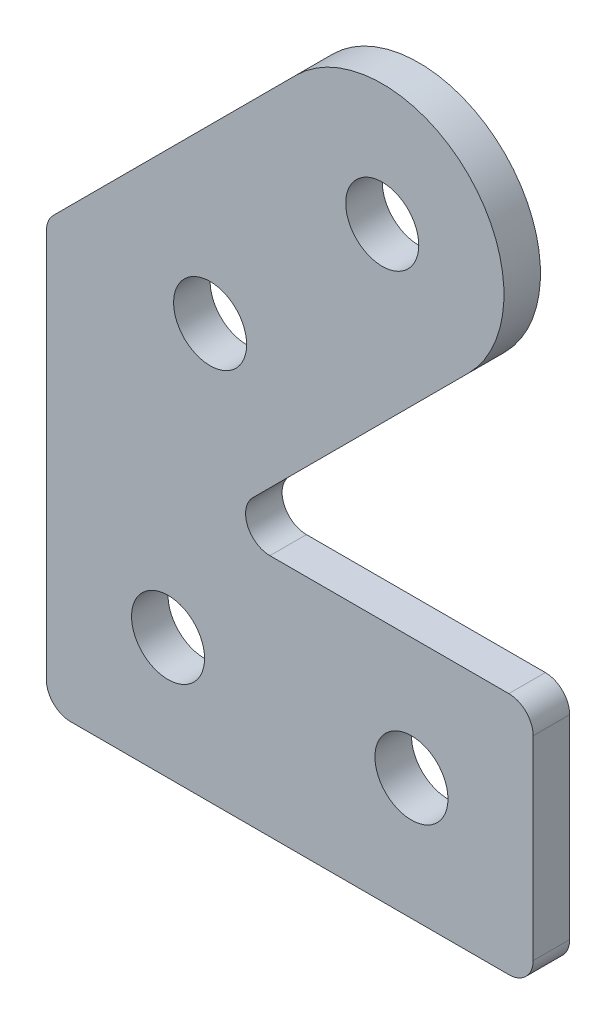
ISO-10303-21;
HEADER;
FILE_DESCRIPTION(('STEP AP214'),'2;1');
FILE_NAME('part.step','',(''),(''),'','','');
FILE_SCHEMA(('AUTOMOTIVE_DESIGN { 1 0 10303 214 1 1 1 1 }'));
ENDSEC;
DATA;
#1=APPLICATION_CONTEXT('core data for automotive mechanical design processes');
#2=APPLICATION_PROTOCOL_DEFINITION('international standard','automotive_design',2000,#1);
#3=PRODUCT_CONTEXT('',#1,'mechanical');
#4=PRODUCT('Part','Part','',(#3));
#5=PRODUCT_RELATED_PRODUCT_CATEGORY('part','',(#4));
#6=PRODUCT_DEFINITION_FORMATION('','',#4);
#7=PRODUCT_DEFINITION_CONTEXT('part definition',#1,'design');
#8=PRODUCT_DEFINITION('design','',#6,#7);
#9=PRODUCT_DEFINITION_SHAPE('','',#8);
#10=(LENGTH_UNIT() NAMED_UNIT(*) SI_UNIT(.MILLI.,.METRE.));
#11=(NAMED_UNIT(*) PLANE_ANGLE_UNIT() SI_UNIT($,.RADIAN.));
#12=(NAMED_UNIT(*) SI_UNIT($,.STERADIAN.) SOLID_ANGLE_UNIT());
#13=UNCERTAINTY_MEASURE_WITH_UNIT(LENGTH_MEASURE(1.E-05),#10,'distance_accuracy_value','');
#14=(GEOMETRIC_REPRESENTATION_CONTEXT(3) GLOBAL_UNCERTAINTY_ASSIGNED_CONTEXT((#13)) GLOBAL_UNIT_ASSIGNED_CONTEXT((#10,
#11,#12)) REPRESENTATION_CONTEXT('',''));
#15=CARTESIAN_POINT('',(0.,0.,0.));
#16=DIRECTION('',(0.,0.,1.));
#17=DIRECTION('',(1.,0.,0.));
#18=AXIS2_PLACEMENT_3D('',#15,#16,#17);
#19=CARTESIAN_POINT('',(20.,10.,1.5));
#20=DIRECTION('',(0.,-1.,0.));
#21=DIRECTION('',(1.,0.,0.));
#22=AXIS2_PLACEMENT_3D('',#19,#20,#21);
#23=PLANE('',#22);
#24=DIRECTION('',(-1.,0.,0.));
#25=VECTOR('',#24,1.);
#26=CARTESIAN_POINT('',(20.,10.,1.5));
#27=LINE('',#26,#25);
#28=CARTESIAN_POINT('',(19.,10.,1.5));
#29=VERTEX_POINT('',#28);
#30=CARTESIAN_POINT('',(9.1852813742386,10.,1.5));
#31=VERTEX_POINT('',#30);
#32=EDGE_CURVE('E171',#29,#31,#27,.T.);
#33=ORIENTED_EDGE('',*,*,#32,.F.);
#34=DIRECTION('',(0.,0.,-1.));
#35=VECTOR('',#34,1.);
#36=CARTESIAN_POINT('',(19.,10.,1.5));
#37=LINE('',#36,#35);
#38=CARTESIAN_POINT('',(19.,10.,0.));
#39=VERTEX_POINT('',#38);
#40=EDGE_CURVE('E236',#29,#39,#37,.T.);
#41=ORIENTED_EDGE('',*,*,#40,.T.);
#42=DIRECTION('',(-1.,0.,0.));
#43=VECTOR('',#42,1.);
#44=CARTESIAN_POINT('',(20.,10.,0.));
#45=LINE('',#44,#43);
#46=CARTESIAN_POINT('',(9.1852813742386,10.,0.));
#47=VERTEX_POINT('',#46);
#48=EDGE_CURVE('E201',#39,#47,#45,.T.);
#49=ORIENTED_EDGE('',*,*,#48,.T.);
#50=DIRECTION('',(0.,0.,-1.));
#51=VECTOR('',#50,1.);
#52=CARTESIAN_POINT('',(9.1852813742386,10.,1.5));
#53=LINE('',#52,#51);
#54=EDGE_CURVE('E234',#47,#31,#53,.F.);
#55=ORIENTED_EDGE('',*,*,#54,.T.);
#56=EDGE_LOOP('',(#33,#41,#49,#55));
#57=FACE_BOUND('',#56,.T.);
#58=ADVANCED_FACE('F32',(#57),#23,.F.);
#59=CARTESIAN_POINT('',(20.,10.,1.5));
#60=DIRECTION('',(-1.,0.,0.));
#61=DIRECTION('',(0.,0.,1.));
#62=AXIS2_PLACEMENT_3D('',#59,#60,#61);
#63=PLANE('',#62);
#64=DIRECTION('',(0.,1.,0.));
#65=VECTOR('',#64,1.);
#66=CARTESIAN_POINT('',(20.,10.,1.5));
#67=LINE('',#66,#65);
#68=CARTESIAN_POINT('',(20.,0.999999999999999,1.5));
#69=VERTEX_POINT('',#68);
#70=CARTESIAN_POINT('',(20.,9.,1.5));
#71=VERTEX_POINT('',#70);
#72=EDGE_CURVE('E168',#69,#71,#67,.T.);
#73=ORIENTED_EDGE('',*,*,#72,.F.);
#74=DIRECTION('',(0.,0.,-1.));
#75=VECTOR('',#74,1.);
#76=CARTESIAN_POINT('',(20.,0.999999999999999,1.5));
#77=LINE('',#76,#75);
#78=CARTESIAN_POINT('',(20.,0.999999999999999,0.));
#79=VERTEX_POINT('',#78);
#80=EDGE_CURVE('E232',#69,#79,#77,.T.);
#81=ORIENTED_EDGE('',*,*,#80,.T.);
#82=DIRECTION('',(0.,1.,0.));
#83=VECTOR('',#82,1.);
#84=CARTESIAN_POINT('',(20.,10.,0.));
#85=LINE('',#84,#83);
#86=CARTESIAN_POINT('',(20.,9.,0.));
#87=VERTEX_POINT('',#86);
#88=EDGE_CURVE('E167',#79,#87,#85,.T.);
#89=ORIENTED_EDGE('',*,*,#88,.T.);
#90=DIRECTION('',(0.,0.,-1.));
#91=VECTOR('',#90,1.);
#92=CARTESIAN_POINT('',(20.,9.,1.5));
#93=LINE('',#92,#91);
#94=EDGE_CURVE('E226',#87,#71,#93,.F.);
#95=ORIENTED_EDGE('',*,*,#94,.T.);
#96=EDGE_LOOP('',(#73,#81,#89,#95));
#97=FACE_BOUND('',#96,.T.);
#98=ADVANCED_FACE('F255',(#97),#63,.F.);
#99=CARTESIAN_POINT('',(0.,0.,1.5));
#100=DIRECTION('',(1.,0.,0.));
#101=DIRECTION('',(0.,0.,-1.));
#102=AXIS2_PLACEMENT_3D('',#99,#100,#101);
#103=PLANE('',#102);
#104=DIRECTION('',(0.,-1.,0.));
#105=VECTOR('',#104,1.);
#106=CARTESIAN_POINT('',(0.,0.,1.5));
#107=LINE('',#106,#105);
#108=CARTESIAN_POINT('',(0.,16.9568542494923,1.5));
#109=VERTEX_POINT('',#108);
#110=CARTESIAN_POINT('',(0.,1.,1.5));
#111=VERTEX_POINT('',#110);
#112=EDGE_CURVE('E175',#109,#111,#107,.T.);
#113=ORIENTED_EDGE('',*,*,#112,.F.);
#114=DIRECTION('',(0.,0.,-1.));
#115=VECTOR('',#114,1.);
#116=CARTESIAN_POINT('',(0.,16.9568542494923,1.5));
#117=LINE('',#116,#115);
#118=CARTESIAN_POINT('',(0.,16.9568542494923,0.));
#119=VERTEX_POINT('',#118);
#120=EDGE_CURVE('E195',#109,#119,#117,.T.);
#121=ORIENTED_EDGE('',*,*,#120,.T.);
#122=DIRECTION('',(0.,-1.,0.));
#123=VECTOR('',#122,1.);
#124=CARTESIAN_POINT('',(0.,0.,0.));
#125=LINE('',#124,#123);
#126=CARTESIAN_POINT('',(0.,1.,0.));
#127=VERTEX_POINT('',#126);
#128=EDGE_CURVE('E205',#119,#127,#125,.T.);
#129=ORIENTED_EDGE('',*,*,#128,.T.);
#130=DIRECTION('',(0.,0.,-1.));
#131=VECTOR('',#130,1.);
#132=CARTESIAN_POINT('',(0.,1.,1.5));
#133=LINE('',#132,#131);
#134=EDGE_CURVE('E193',#127,#111,#133,.F.);
#135=ORIENTED_EDGE('',*,*,#134,.T.);
#136=EDGE_LOOP('',(#113,#121,#129,#135));
#137=FACE_BOUND('',#136,.T.);
#138=ADVANCED_FACE('F260',(#137),#103,.F.);
#139=CARTESIAN_POINT('',(0.,0.,1.5));
#140=DIRECTION('',(0.,1.,0.));
#141=DIRECTION('',(0.,0.,1.));
#142=AXIS2_PLACEMENT_3D('',#139,#140,#141);
#143=PLANE('',#142);
#144=DIRECTION('',(1.,0.,0.));
#145=VECTOR('',#144,1.);
#146=CARTESIAN_POINT('',(0.,0.,1.5));
#147=LINE('',#146,#145);
#148=CARTESIAN_POINT('',(1.,0.,1.5));
#149=VERTEX_POINT('',#148);
#150=CARTESIAN_POINT('',(19.,0.,1.5));
#151=VERTEX_POINT('',#150);
#152=EDGE_CURVE('E196',#149,#151,#147,.T.);
#153=ORIENTED_EDGE('',*,*,#152,.F.);
#154=DIRECTION('',(0.,0.,-1.));
#155=VECTOR('',#154,1.);
#156=CARTESIAN_POINT('',(1.,0.,1.5));
#157=LINE('',#156,#155);
#158=CARTESIAN_POINT('',(1.,0.,0.));
#159=VERTEX_POINT('',#158);
#160=EDGE_CURVE('E215',#149,#159,#157,.T.);
#161=ORIENTED_EDGE('',*,*,#160,.T.);
#162=DIRECTION('',(1.,0.,0.));
#163=VECTOR('',#162,1.);
#164=CARTESIAN_POINT('',(0.,0.,0.));
#165=LINE('',#164,#163);
#166=CARTESIAN_POINT('',(19.,0.,0.));
#167=VERTEX_POINT('',#166);
#168=EDGE_CURVE('E172',#159,#167,#165,.T.);
#169=ORIENTED_EDGE('',*,*,#168,.T.);
#170=DIRECTION('',(0.,0.,-1.));
#171=VECTOR('',#170,1.);
#172=CARTESIAN_POINT('',(19.,0.,1.5));
#173=LINE('',#172,#171);
#174=EDGE_CURVE('E47',#167,#151,#173,.F.);
#175=ORIENTED_EDGE('',*,*,#174,.T.);
#176=EDGE_LOOP('',(#153,#161,#169,#175));
#177=FACE_BOUND('',#176,.T.);
#178=ADVANCED_FACE('F213',(#177),#143,.F.);
#179=CARTESIAN_POINT('',(0.,0.,1.5));
#180=DIRECTION('',(0.,0.,1.));
#181=DIRECTION('',(1.,0.,0.));
#182=AXIS2_PLACEMENT_3D('',#179,#180,#181);
#183=PLANE('',#182);
#184=CARTESIAN_POINT('',(13.8,24.1,1.5));
#185=DIRECTION('',(0.,0.,1.));
#186=DIRECTION('',(1.,0.,0.));
#187=AXIS2_PLACEMENT_3D('',#184,#185,#186);
#188=CIRCLE('',#187,1.49999999999999);
#189=CARTESIAN_POINT('',(15.3,24.1,1.5));
#190=VERTEX_POINT('',#189);
#191=EDGE_CURVE('E452',#190,#190,#188,.T.);
#192=ORIENTED_EDGE('',*,*,#191,.F.);
#193=EDGE_LOOP('',(#192));
#194=FACE_BOUND('',#193,.T.);
#195=CARTESIAN_POINT('',(6.72893218813453,17.0289321881345,1.5));
#196=DIRECTION('',(0.,0.,1.));
#197=DIRECTION('',(1.,0.,0.));
#198=AXIS2_PLACEMENT_3D('',#195,#196,#197);
#199=CIRCLE('',#198,1.49999999999999);
#200=CARTESIAN_POINT('',(8.22893218813452,17.0289321881345,1.5));
#201=VERTEX_POINT('',#200);
#202=EDGE_CURVE('E192',#201,#201,#199,.T.);
#203=ORIENTED_EDGE('',*,*,#202,.F.);
#204=EDGE_LOOP('',(#203));
#205=FACE_BOUND('',#204,.T.);
#206=CARTESIAN_POINT('',(5.,5.,1.5));
#207=DIRECTION('',(0.,0.,1.));
#208=DIRECTION('',(1.,0.,0.));
#209=AXIS2_PLACEMENT_3D('',#206,#207,#208);
#210=CIRCLE('',#209,1.5);
#211=CARTESIAN_POINT('',(6.5,5.,1.5));
#212=VERTEX_POINT('',#211);
#213=EDGE_CURVE('E132',#212,#212,#210,.T.);
#214=ORIENTED_EDGE('',*,*,#213,.F.);
#215=EDGE_LOOP('',(#214));
#216=FACE_BOUND('',#215,.T.);
#217=CARTESIAN_POINT('',(15.,5.,1.5));
#218=DIRECTION('',(0.,0.,1.));
#219=DIRECTION('',(1.,0.,0.));
#220=AXIS2_PLACEMENT_3D('',#217,#218,#219);
#221=CIRCLE('',#220,1.5);
#222=CARTESIAN_POINT('',(16.5,5.,1.5));
#223=VERTEX_POINT('',#222);
#224=EDGE_CURVE('E161',#223,#223,#221,.T.);
#225=ORIENTED_EDGE('',*,*,#224,.F.);
#226=EDGE_LOOP('',(#225));
#227=FACE_BOUND('',#226,.T.);
#228=DIRECTION('',(-0.707106781186546,-0.707106781186549,0.));
#229=VECTOR('',#228,1.);
#230=CARTESIAN_POINT('',(0.,17.3710678118654,1.5));
#231=LINE('',#230,#229);
#232=CARTESIAN_POINT('',(10.2644660940673,27.6355339059327,1.5));
#233=VERTEX_POINT('',#232);
#234=CARTESIAN_POINT('',(0.29289321881345,17.6639610306789,1.5));
#235=VERTEX_POINT('',#234);
#236=EDGE_CURVE('E133',#233,#235,#231,.T.);
#237=ORIENTED_EDGE('',*,*,#236,.T.);
#238=CARTESIAN_POINT('',(1.,16.9568542494923,1.5));
#239=DIRECTION('',(0.,0.,1.));
#240=DIRECTION('',(1.,0.,0.));
#241=AXIS2_PLACEMENT_3D('',#238,#239,#240);
#242=CIRCLE('',#241,1.);
#243=EDGE_CURVE('E224',#235,#109,#242,.T.);
#244=ORIENTED_EDGE('',*,*,#243,.T.);
#245=ORIENTED_EDGE('',*,*,#112,.T.);
#246=CARTESIAN_POINT('',(1.,1.,1.5));
#247=DIRECTION('',(0.,0.,1.));
#248=DIRECTION('',(1.,0.,0.));
#249=AXIS2_PLACEMENT_3D('',#246,#247,#248);
#250=CIRCLE('',#249,1.);
#251=EDGE_CURVE('E54',#111,#149,#250,.T.);
#252=ORIENTED_EDGE('',*,*,#251,.T.);
#253=ORIENTED_EDGE('',*,*,#152,.T.);
#254=CARTESIAN_POINT('',(19.,0.999999999999999,1.5));
#255=DIRECTION('',(0.,0.,1.));
#256=DIRECTION('',(1.,0.,0.));
#257=AXIS2_PLACEMENT_3D('',#254,#255,#256);
#258=CIRCLE('',#257,1.);
#259=EDGE_CURVE('E223',#151,#69,#258,.T.);
#260=ORIENTED_EDGE('',*,*,#259,.T.);
#261=ORIENTED_EDGE('',*,*,#72,.T.);
#262=CARTESIAN_POINT('',(19.,9.,1.5));
#263=DIRECTION('',(0.,0.,1.));
#264=DIRECTION('',(1.,0.,0.));
#265=AXIS2_PLACEMENT_3D('',#262,#263,#264);
#266=CIRCLE('',#265,1.);
#267=EDGE_CURVE('E183',#71,#29,#266,.T.);
#268=ORIENTED_EDGE('',*,*,#267,.T.);
#269=ORIENTED_EDGE('',*,*,#32,.T.);
#270=CARTESIAN_POINT('',(9.1852813742386,11.,1.5));
#271=DIRECTION('',(0.,0.,1.));
#272=DIRECTION('',(1.,0.,0.));
#273=AXIS2_PLACEMENT_3D('',#270,#271,#272);
#274=CIRCLE('',#273,1.);
#275=CARTESIAN_POINT('',(8.47817459305205,11.7071067811865,1.5));
#276=VERTEX_POINT('',#275);
#277=EDGE_CURVE('E11',#31,#276,#274,.F.);
#278=ORIENTED_EDGE('',*,*,#277,.T.);
#279=DIRECTION('',(0.707106781186546,0.707106781186549,0.));
#280=VECTOR('',#279,1.);
#281=CARTESIAN_POINT('',(17.3355339059328,20.5644660940673,1.5));
#282=LINE('',#281,#280);
#283=CARTESIAN_POINT('',(17.3355339059328,20.5644660940673,1.5));
#284=VERTEX_POINT('',#283);
#285=EDGE_CURVE('E121',#276,#284,#282,.T.);
#286=ORIENTED_EDGE('',*,*,#285,.T.);
#287=CARTESIAN_POINT('',(13.8,24.1,1.5));
#288=DIRECTION('',(0.,0.,1.));
#289=DIRECTION('',(1.,0.,0.));
#290=AXIS2_PLACEMENT_3D('',#287,#288,#289);
#291=CIRCLE('',#290,5.);
#292=EDGE_CURVE('E126',#284,#233,#291,.T.);
#293=ORIENTED_EDGE('',*,*,#292,.T.);
#294=EDGE_LOOP('',(#237,#244,#245,#252,#253,#260,#261,#268,#269,#278,#286,#293));
#295=FACE_BOUND('',#294,.T.);
#296=ADVANCED_FACE('F124',(#194,#205,#216,#227,#295),#183,.T.);
#297=CARTESIAN_POINT('',(0.,0.,0.));
#298=DIRECTION('',(0.,0.,1.));
#299=DIRECTION('',(1.,0.,0.));
#300=AXIS2_PLACEMENT_3D('',#297,#298,#299);
#301=PLANE('',#300);
#302=CARTESIAN_POINT('',(13.8,24.1,0.));
#303=DIRECTION('',(0.,0.,1.));
#304=DIRECTION('',(1.,0.,0.));
#305=AXIS2_PLACEMENT_3D('',#302,#303,#304);
#306=CIRCLE('',#305,1.49999999999999);
#307=CARTESIAN_POINT('',(15.3,24.1,0.));
#308=VERTEX_POINT('',#307);
#309=EDGE_CURVE('E449',#308,#308,#306,.T.);
#310=ORIENTED_EDGE('',*,*,#309,.T.);
#311=EDGE_LOOP('',(#310));
#312=FACE_BOUND('',#311,.T.);
#313=CARTESIAN_POINT('',(6.72893218813453,17.0289321881345,0.));
#314=DIRECTION('',(0.,0.,1.));
#315=DIRECTION('',(1.,0.,0.));
#316=AXIS2_PLACEMENT_3D('',#313,#314,#315);
#317=CIRCLE('',#316,1.49999999999999);
#318=CARTESIAN_POINT('',(8.22893218813452,17.0289321881345,0.));
#319=VERTEX_POINT('',#318);
#320=EDGE_CURVE('E155',#319,#319,#317,.T.);
#321=ORIENTED_EDGE('',*,*,#320,.T.);
#322=EDGE_LOOP('',(#321));
#323=FACE_BOUND('',#322,.T.);
#324=CARTESIAN_POINT('',(5.,5.,0.));
#325=DIRECTION('',(0.,0.,1.));
#326=DIRECTION('',(1.,0.,0.));
#327=AXIS2_PLACEMENT_3D('',#324,#325,#326);
#328=CIRCLE('',#327,1.5);
#329=CARTESIAN_POINT('',(6.5,5.,0.));
#330=VERTEX_POINT('',#329);
#331=EDGE_CURVE('E158',#330,#330,#328,.T.);
#332=ORIENTED_EDGE('',*,*,#331,.T.);
#333=EDGE_LOOP('',(#332));
#334=FACE_BOUND('',#333,.T.);
#335=CARTESIAN_POINT('',(15.,5.,0.));
#336=DIRECTION('',(0.,0.,1.));
#337=DIRECTION('',(1.,0.,0.));
#338=AXIS2_PLACEMENT_3D('',#335,#336,#337);
#339=CIRCLE('',#338,1.5);
#340=CARTESIAN_POINT('',(16.5,5.,0.));
#341=VERTEX_POINT('',#340);
#342=EDGE_CURVE('E164',#341,#341,#339,.T.);
#343=ORIENTED_EDGE('',*,*,#342,.T.);
#344=EDGE_LOOP('',(#343));
#345=FACE_BOUND('',#344,.T.);
#346=ORIENTED_EDGE('',*,*,#128,.F.);
#347=CARTESIAN_POINT('',(1.,16.9568542494923,0.));
#348=DIRECTION('',(0.,0.,1.));
#349=DIRECTION('',(1.,0.,0.));
#350=AXIS2_PLACEMENT_3D('',#347,#348,#349);
#351=CIRCLE('',#350,1.);
#352=CARTESIAN_POINT('',(0.29289321881345,17.6639610306789,0.));
#353=VERTEX_POINT('',#352);
#354=EDGE_CURVE('E436',#119,#353,#351,.F.);
#355=ORIENTED_EDGE('',*,*,#354,.T.);
#356=DIRECTION('',(-0.707106781186546,-0.707106781186549,0.));
#357=VECTOR('',#356,1.);
#358=CARTESIAN_POINT('',(0.,17.3710678118654,0.));
#359=LINE('',#358,#357);
#360=CARTESIAN_POINT('',(10.2644660940673,27.6355339059327,0.));
#361=VERTEX_POINT('',#360);
#362=EDGE_CURVE('E154',#361,#353,#359,.T.);
#363=ORIENTED_EDGE('',*,*,#362,.F.);
#364=CARTESIAN_POINT('',(13.8,24.1,0.));
#365=DIRECTION('',(0.,0.,1.));
#366=DIRECTION('',(-1.,0.,0.));
#367=AXIS2_PLACEMENT_3D('',#364,#365,#366);
#368=CIRCLE('',#367,5.);
#369=CARTESIAN_POINT('',(17.3355339059328,20.5644660940673,0.));
#370=VERTEX_POINT('',#369);
#371=EDGE_CURVE('E143',#370,#361,#368,.T.);
#372=ORIENTED_EDGE('',*,*,#371,.F.);
#373=DIRECTION('',(0.707106781186546,0.707106781186549,0.));
#374=VECTOR('',#373,1.);
#375=CARTESIAN_POINT('',(17.3355339059328,20.5644660940673,0.));
#376=LINE('',#375,#374);
#377=CARTESIAN_POINT('',(8.47817459305205,11.7071067811865,0.));
#378=VERTEX_POINT('',#377);
#379=EDGE_CURVE('E139',#378,#370,#376,.T.);
#380=ORIENTED_EDGE('',*,*,#379,.F.);
#381=CARTESIAN_POINT('',(9.1852813742386,11.,0.));
#382=DIRECTION('',(0.,0.,1.));
#383=DIRECTION('',(1.,0.,0.));
#384=AXIS2_PLACEMENT_3D('',#381,#382,#383);
#385=CIRCLE('',#384,1.);
#386=EDGE_CURVE('E40',#378,#47,#385,.T.);
#387=ORIENTED_EDGE('',*,*,#386,.T.);
#388=ORIENTED_EDGE('',*,*,#48,.F.);
#389=CARTESIAN_POINT('',(19.,9.,0.));
#390=DIRECTION('',(0.,0.,1.));
#391=DIRECTION('',(1.,0.,0.));
#392=AXIS2_PLACEMENT_3D('',#389,#390,#391);
#393=CIRCLE('',#392,1.);
#394=EDGE_CURVE('E199',#39,#87,#393,.F.);
#395=ORIENTED_EDGE('',*,*,#394,.T.);
#396=ORIENTED_EDGE('',*,*,#88,.F.);
#397=CARTESIAN_POINT('',(19.,0.999999999999999,0.));
#398=DIRECTION('',(0.,0.,1.));
#399=DIRECTION('',(1.,0.,0.));
#400=AXIS2_PLACEMENT_3D('',#397,#398,#399);
#401=CIRCLE('',#400,1.);
#402=EDGE_CURVE('E221',#79,#167,#401,.F.);
#403=ORIENTED_EDGE('',*,*,#402,.T.);
#404=ORIENTED_EDGE('',*,*,#168,.F.);
#405=CARTESIAN_POINT('',(1.,1.,0.));
#406=DIRECTION('',(0.,0.,1.));
#407=DIRECTION('',(1.,0.,0.));
#408=AXIS2_PLACEMENT_3D('',#405,#406,#407);
#409=CIRCLE('',#408,1.);
#410=EDGE_CURVE('E439',#159,#127,#409,.F.);
#411=ORIENTED_EDGE('',*,*,#410,.T.);
#412=EDGE_LOOP('',(#346,#355,#363,#372,#380,#387,#388,#395,#396,#403,#404,#411));
#413=FACE_BOUND('',#412,.T.);
#414=ADVANCED_FACE('F242',(#312,#323,#334,#345,#413),#301,.F.);
#415=CARTESIAN_POINT('',(15.,5.,1.5));
#416=DIRECTION('',(0.,0.,1.));
#417=DIRECTION('',(1.,0.,0.));
#418=AXIS2_PLACEMENT_3D('',#415,#416,#417);
#419=CYLINDRICAL_SURFACE('',#418,1.5);
#420=ORIENTED_EDGE('',*,*,#342,.F.);
#421=EDGE_LOOP('',(#420));
#422=FACE_BOUND('',#421,.T.);
#423=ORIENTED_EDGE('',*,*,#224,.T.);
#424=EDGE_LOOP('',(#423));
#425=FACE_BOUND('',#424,.T.);
#426=ADVANCED_FACE('F352',(#422,#425),#419,.F.);
#427=CARTESIAN_POINT('',(5.,5.,1.5));
#428=DIRECTION('',(0.,0.,1.));
#429=DIRECTION('',(1.,0.,0.));
#430=AXIS2_PLACEMENT_3D('',#427,#428,#429);
#431=CYLINDRICAL_SURFACE('',#430,1.5);
#432=ORIENTED_EDGE('',*,*,#331,.F.);
#433=EDGE_LOOP('',(#432));
#434=FACE_BOUND('',#433,.T.);
#435=ORIENTED_EDGE('',*,*,#213,.T.);
#436=EDGE_LOOP('',(#435));
#437=FACE_BOUND('',#436,.T.);
#438=ADVANCED_FACE('F342',(#434,#437),#431,.F.);
#439=CARTESIAN_POINT('',(0.,17.3710678118654,28.3001865665148));
#440=DIRECTION('',(0.707106781186549,-0.707106781186546,0.));
#441=DIRECTION('',(0.707106781186546,0.707106781186549,0.));
#442=AXIS2_PLACEMENT_3D('',#439,#440,#441);
#443=PLANE('',#442);
#444=ORIENTED_EDGE('',*,*,#362,.T.);
#445=DIRECTION('',(0.,0.,-1.));
#446=VECTOR('',#445,1.);
#447=CARTESIAN_POINT('',(0.29289321881345,17.6639610306789,28.3001865665148));
#448=LINE('',#447,#446);
#449=EDGE_CURVE('E179',#353,#235,#448,.F.);
#450=ORIENTED_EDGE('',*,*,#449,.T.);
#451=ORIENTED_EDGE('',*,*,#236,.F.);
#452=DIRECTION('',(0.,0.,-1.));
#453=VECTOR('',#452,1.);
#454=CARTESIAN_POINT('',(10.2644660940673,27.6355339059327,28.3001865665148));
#455=LINE('',#454,#453);
#456=EDGE_CURVE('E146',#233,#361,#455,.T.);
#457=ORIENTED_EDGE('',*,*,#456,.T.);
#458=EDGE_LOOP('',(#444,#450,#451,#457));
#459=FACE_BOUND('',#458,.T.);
#460=ADVANCED_FACE('F334',(#459),#443,.F.);
#461=CARTESIAN_POINT('',(17.3355339059328,20.5644660940673,28.3001865665148));
#462=DIRECTION('',(-0.707106781186549,0.707106781186546,0.));
#463=DIRECTION('',(-0.707106781186546,-0.707106781186549,0.));
#464=AXIS2_PLACEMENT_3D('',#461,#462,#463);
#465=PLANE('',#464);
#466=ORIENTED_EDGE('',*,*,#285,.F.);
#467=DIRECTION('',(0.,0.,-1.));
#468=VECTOR('',#467,1.);
#469=CARTESIAN_POINT('',(8.47817459305205,11.7071067811865,0.));
#470=LINE('',#469,#468);
#471=EDGE_CURVE('E239',#276,#378,#470,.T.);
#472=ORIENTED_EDGE('',*,*,#471,.T.);
#473=ORIENTED_EDGE('',*,*,#379,.T.);
#474=DIRECTION('',(0.,0.,-1.));
#475=VECTOR('',#474,1.);
#476=CARTESIAN_POINT('',(17.3355339059328,20.5644660940673,28.3001865665148));
#477=LINE('',#476,#475);
#478=EDGE_CURVE('E136',#284,#370,#477,.T.);
#479=ORIENTED_EDGE('',*,*,#478,.F.);
#480=EDGE_LOOP('',(#466,#472,#473,#479));
#481=FACE_BOUND('',#480,.T.);
#482=ADVANCED_FACE('F137',(#481),#465,.F.);
#483=CARTESIAN_POINT('',(13.8,24.1,28.3001865665148));
#484=DIRECTION('',(0.,0.,-1.));
#485=DIRECTION('',(-1.,0.,0.));
#486=AXIS2_PLACEMENT_3D('',#483,#484,#485);
#487=CYLINDRICAL_SURFACE('',#486,5.);
#488=ORIENTED_EDGE('',*,*,#292,.F.);
#489=ORIENTED_EDGE('',*,*,#478,.T.);
#490=ORIENTED_EDGE('',*,*,#371,.T.);
#491=ORIENTED_EDGE('',*,*,#456,.F.);
#492=EDGE_LOOP('',(#488,#489,#490,#491));
#493=FACE_BOUND('',#492,.T.);
#494=ADVANCED_FACE('F145',(#493),#487,.T.);
#495=CARTESIAN_POINT('',(6.72893218813453,17.0289321881345,1.5));
#496=DIRECTION('',(0.,0.,1.));
#497=DIRECTION('',(1.,0.,0.));
#498=AXIS2_PLACEMENT_3D('',#495,#496,#497);
#499=CYLINDRICAL_SURFACE('',#498,1.49999999999999);
#500=ORIENTED_EDGE('',*,*,#202,.T.);
#501=EDGE_LOOP('',(#500));
#502=FACE_BOUND('',#501,.T.);
#503=ORIENTED_EDGE('',*,*,#320,.F.);
#504=EDGE_LOOP('',(#503));
#505=FACE_BOUND('',#504,.T.);
#506=ADVANCED_FACE('F310',(#502,#505),#499,.F.);
#507=CARTESIAN_POINT('',(13.8,24.1,1.5));
#508=DIRECTION('',(0.,0.,1.));
#509=DIRECTION('',(1.,0.,0.));
#510=AXIS2_PLACEMENT_3D('',#507,#508,#509);
#511=CYLINDRICAL_SURFACE('',#510,1.49999999999999);
#512=ORIENTED_EDGE('',*,*,#191,.T.);
#513=EDGE_LOOP('',(#512));
#514=FACE_BOUND('',#513,.T.);
#515=ORIENTED_EDGE('',*,*,#309,.F.);
#516=EDGE_LOOP('',(#515));
#517=FACE_BOUND('',#516,.T.);
#518=ADVANCED_FACE('F270',(#514,#517),#511,.F.);
#519=CARTESIAN_POINT('',(1.,16.9568542494923,1.5));
#520=DIRECTION('',(0.,0.,-1.));
#521=DIRECTION('',(-1.,0.,0.));
#522=AXIS2_PLACEMENT_3D('',#519,#520,#521);
#523=CYLINDRICAL_SURFACE('',#522,1.);
#524=ORIENTED_EDGE('',*,*,#243,.F.);
#525=ORIENTED_EDGE('',*,*,#449,.F.);
#526=ORIENTED_EDGE('',*,*,#354,.F.);
#527=ORIENTED_EDGE('',*,*,#120,.F.);
#528=EDGE_LOOP('',(#524,#525,#526,#527));
#529=FACE_BOUND('',#528,.T.);
#530=ADVANCED_FACE('F266',(#529),#523,.T.);
#531=CARTESIAN_POINT('',(1.,1.,1.5));
#532=DIRECTION('',(0.,0.,-1.));
#533=DIRECTION('',(-1.,0.,0.));
#534=AXIS2_PLACEMENT_3D('',#531,#532,#533);
#535=CYLINDRICAL_SURFACE('',#534,1.);
#536=ORIENTED_EDGE('',*,*,#251,.F.);
#537=ORIENTED_EDGE('',*,*,#134,.F.);
#538=ORIENTED_EDGE('',*,*,#410,.F.);
#539=ORIENTED_EDGE('',*,*,#160,.F.);
#540=EDGE_LOOP('',(#536,#537,#538,#539));
#541=FACE_BOUND('',#540,.T.);
#542=ADVANCED_FACE('F269',(#541),#535,.T.);
#543=CARTESIAN_POINT('',(19.,0.999999999999999,1.5));
#544=DIRECTION('',(0.,0.,-1.));
#545=DIRECTION('',(-1.,0.,0.));
#546=AXIS2_PLACEMENT_3D('',#543,#544,#545);
#547=CYLINDRICAL_SURFACE('',#546,1.);
#548=ORIENTED_EDGE('',*,*,#259,.F.);
#549=ORIENTED_EDGE('',*,*,#174,.F.);
#550=ORIENTED_EDGE('',*,*,#402,.F.);
#551=ORIENTED_EDGE('',*,*,#80,.F.);
#552=EDGE_LOOP('',(#548,#549,#550,#551));
#553=FACE_BOUND('',#552,.T.);
#554=ADVANCED_FACE('F219',(#553),#547,.T.);
#555=CARTESIAN_POINT('',(19.,9.,1.5));
#556=DIRECTION('',(0.,0.,-1.));
#557=DIRECTION('',(-1.,0.,0.));
#558=AXIS2_PLACEMENT_3D('',#555,#556,#557);
#559=CYLINDRICAL_SURFACE('',#558,1.);
#560=ORIENTED_EDGE('',*,*,#267,.F.);
#561=ORIENTED_EDGE('',*,*,#94,.F.);
#562=ORIENTED_EDGE('',*,*,#394,.F.);
#563=ORIENTED_EDGE('',*,*,#40,.F.);
#564=EDGE_LOOP('',(#560,#561,#562,#563));
#565=FACE_BOUND('',#564,.T.);
#566=ADVANCED_FACE('F249',(#565),#559,.T.);
#567=CARTESIAN_POINT('',(9.1852813742386,11.,28.3001865665148));
#568=DIRECTION('',(0.,0.,1.));
#569=DIRECTION('',(1.,0.,0.));
#570=AXIS2_PLACEMENT_3D('',#567,#568,#569);
#571=CYLINDRICAL_SURFACE('',#570,1.);
#572=ORIENTED_EDGE('',*,*,#277,.F.);
#573=ORIENTED_EDGE('',*,*,#54,.F.);
#574=ORIENTED_EDGE('',*,*,#386,.F.);
#575=ORIENTED_EDGE('',*,*,#471,.F.);
#576=EDGE_LOOP('',(#572,#573,#574,#575));
#577=FACE_BOUND('',#576,.T.);
#578=ADVANCED_FACE('F34',(#577),#571,.F.);
#579=CLOSED_SHELL('',(#58,#98,#138,#178,#296,#414,#426,#438,#460,#482,#494,#506,#518,#530,#542,
#554,#566,#578));
#580=MANIFOLD_SOLID_BREP('B2',#579);
#581=ADVANCED_BREP_SHAPE_REPRESENTATION('',(#18,#580),#14);
#582=SHAPE_DEFINITION_REPRESENTATION(#9,#581);
ENDSEC;
END-ISO-10303-21;
